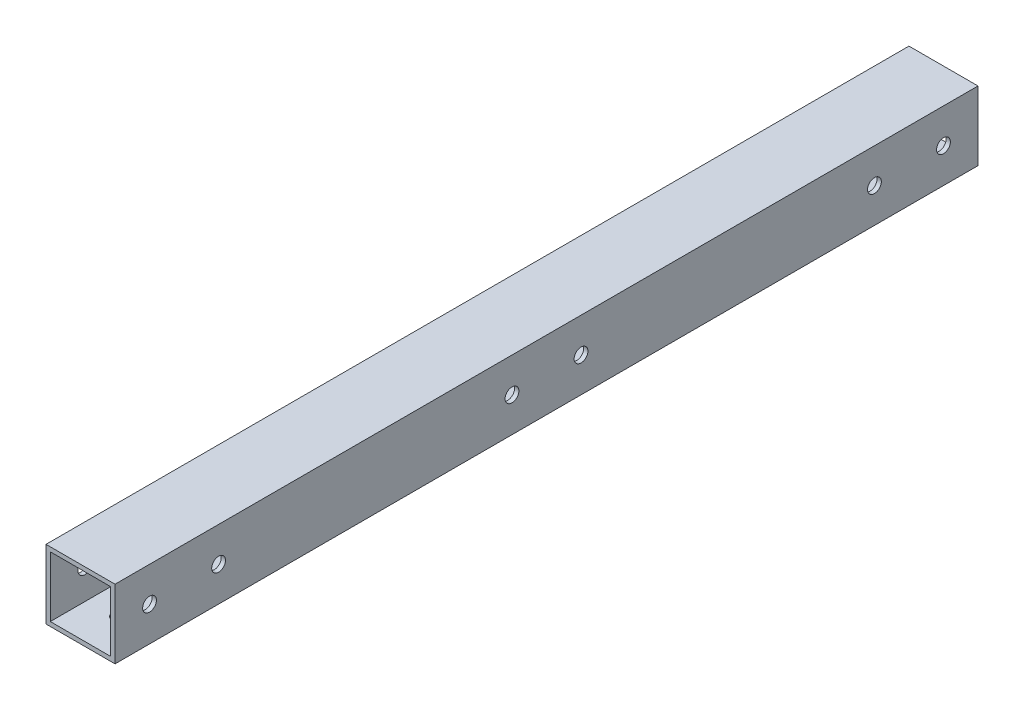
ISO-10303-21;
HEADER;
FILE_DESCRIPTION(('STEP AP214'),'2;1');
FILE_NAME('part.step','',(''),(''),'','','');
FILE_SCHEMA(('AUTOMOTIVE_DESIGN { 1 0 10303 214 1 1 1 1 }'));
ENDSEC;
DATA;
#1=APPLICATION_CONTEXT('core data for automotive mechanical design processes');
#2=APPLICATION_PROTOCOL_DEFINITION('international standard','automotive_design',2000,#1);
#3=PRODUCT_CONTEXT('',#1,'mechanical');
#4=PRODUCT('Part','Part','',(#3));
#5=PRODUCT_RELATED_PRODUCT_CATEGORY('part','',(#4));
#6=PRODUCT_DEFINITION_FORMATION('','',#4);
#7=PRODUCT_DEFINITION_CONTEXT('part definition',#1,'design');
#8=PRODUCT_DEFINITION('design','',#6,#7);
#9=PRODUCT_DEFINITION_SHAPE('','',#8);
#10=(LENGTH_UNIT() NAMED_UNIT(*) SI_UNIT(.MILLI.,.METRE.));
#11=(NAMED_UNIT(*) PLANE_ANGLE_UNIT() SI_UNIT($,.RADIAN.));
#12=(NAMED_UNIT(*) SI_UNIT($,.STERADIAN.) SOLID_ANGLE_UNIT());
#13=UNCERTAINTY_MEASURE_WITH_UNIT(LENGTH_MEASURE(1.E-05),#10,'distance_accuracy_value','');
#14=(GEOMETRIC_REPRESENTATION_CONTEXT(3) GLOBAL_UNCERTAINTY_ASSIGNED_CONTEXT((#13)) GLOBAL_UNIT_ASSIGNED_CONTEXT((#10,
#11,#12)) REPRESENTATION_CONTEXT('',''));
#15=CARTESIAN_POINT('',(0.,0.,0.));
#16=DIRECTION('',(0.,0.,1.));
#17=DIRECTION('',(1.,0.,0.));
#18=AXIS2_PLACEMENT_3D('',#15,#16,#17);
#19=CARTESIAN_POINT('',(0.,0.,317.5));
#20=DIRECTION('',(0.,0.,-1.));
#21=DIRECTION('',(-1.,0.,0.));
#22=AXIS2_PLACEMENT_3D('',#19,#20,#21);
#23=PLANE('',#22);
#24=DIRECTION('',(0.,-1.,0.));
#25=VECTOR('',#24,1.);
#26=CARTESIAN_POINT('',(0.,0.,317.5));
#27=LINE('',#26,#25);
#28=CARTESIAN_POINT('',(0.,25.4,317.5));
#29=VERTEX_POINT('',#28);
#30=CARTESIAN_POINT('',(0.,0.,317.5));
#31=VERTEX_POINT('',#30);
#32=EDGE_CURVE('E157',#29,#31,#27,.T.);
#33=ORIENTED_EDGE('',*,*,#32,.T.);
#34=DIRECTION('',(1.,0.,0.));
#35=VECTOR('',#34,1.);
#36=CARTESIAN_POINT('',(0.,0.,317.5));
#37=LINE('',#36,#35);
#38=CARTESIAN_POINT('',(25.4,0.,317.5));
#39=VERTEX_POINT('',#38);
#40=EDGE_CURVE('E161',#31,#39,#37,.T.);
#41=ORIENTED_EDGE('',*,*,#40,.T.);
#42=DIRECTION('',(0.,1.,0.));
#43=VECTOR('',#42,1.);
#44=CARTESIAN_POINT('',(25.4,0.,317.5));
#45=LINE('',#44,#43);
#46=CARTESIAN_POINT('',(25.4,25.4,317.5));
#47=VERTEX_POINT('',#46);
#48=EDGE_CURVE('E165',#39,#47,#45,.T.);
#49=ORIENTED_EDGE('',*,*,#48,.T.);
#50=DIRECTION('',(-1.,0.,0.));
#51=VECTOR('',#50,1.);
#52=CARTESIAN_POINT('',(0.,25.4,317.5));
#53=LINE('',#52,#51);
#54=EDGE_CURVE('E168',#47,#29,#53,.T.);
#55=ORIENTED_EDGE('',*,*,#54,.T.);
#56=EDGE_LOOP('',(#33,#41,#49,#55));
#57=FACE_BOUND('',#56,.T.);
#58=DIRECTION('',(0.,-1.,0.));
#59=VECTOR('',#58,1.);
#60=CARTESIAN_POINT('',(1.5875,1.5875,317.5));
#61=LINE('',#60,#59);
#62=CARTESIAN_POINT('',(1.5875,23.8125,317.5));
#63=VERTEX_POINT('',#62);
#64=CARTESIAN_POINT('',(1.5875,1.5875,317.5));
#65=VERTEX_POINT('',#64);
#66=EDGE_CURVE('E107',#63,#65,#61,.T.);
#67=ORIENTED_EDGE('',*,*,#66,.F.);
#68=DIRECTION('',(-1.,0.,0.));
#69=VECTOR('',#68,1.);
#70=CARTESIAN_POINT('',(1.5875,23.8125,317.5));
#71=LINE('',#70,#69);
#72=CARTESIAN_POINT('',(23.8125,23.8125,317.5));
#73=VERTEX_POINT('',#72);
#74=EDGE_CURVE('E133',#73,#63,#71,.T.);
#75=ORIENTED_EDGE('',*,*,#74,.F.);
#76=DIRECTION('',(0.,1.,0.));
#77=VECTOR('',#76,1.);
#78=CARTESIAN_POINT('',(23.8125,1.5875,317.5));
#79=LINE('',#78,#77);
#80=CARTESIAN_POINT('',(23.8125,1.5875,317.5));
#81=VERTEX_POINT('',#80);
#82=EDGE_CURVE('E129',#81,#73,#79,.T.);
#83=ORIENTED_EDGE('',*,*,#82,.F.);
#84=DIRECTION('',(1.,0.,0.));
#85=VECTOR('',#84,1.);
#86=CARTESIAN_POINT('',(1.5875,1.5875,317.5));
#87=LINE('',#86,#85);
#88=EDGE_CURVE('E116',#65,#81,#87,.T.);
#89=ORIENTED_EDGE('',*,*,#88,.F.);
#90=EDGE_LOOP('',(#67,#75,#83,#89));
#91=FACE_BOUND('',#90,.T.);
#92=ADVANCED_FACE('F39',(#57,#91),#23,.F.);
#93=CARTESIAN_POINT('',(0.,0.,0.));
#94=DIRECTION('',(0.,0.,-1.));
#95=DIRECTION('',(-1.,0.,0.));
#96=AXIS2_PLACEMENT_3D('',#93,#94,#95);
#97=PLANE('',#96);
#98=DIRECTION('',(0.,-1.,0.));
#99=VECTOR('',#98,1.);
#100=CARTESIAN_POINT('',(0.,0.,0.));
#101=LINE('',#100,#99);
#102=CARTESIAN_POINT('',(0.,25.4,0.));
#103=VERTEX_POINT('',#102);
#104=CARTESIAN_POINT('',(0.,0.,0.));
#105=VERTEX_POINT('',#104);
#106=EDGE_CURVE('E125',#103,#105,#101,.T.);
#107=ORIENTED_EDGE('',*,*,#106,.F.);
#108=DIRECTION('',(-1.,0.,0.));
#109=VECTOR('',#108,1.);
#110=CARTESIAN_POINT('',(0.,25.4,0.));
#111=LINE('',#110,#109);
#112=CARTESIAN_POINT('',(25.4,25.4,0.));
#113=VERTEX_POINT('',#112);
#114=EDGE_CURVE('E162',#113,#103,#111,.T.);
#115=ORIENTED_EDGE('',*,*,#114,.F.);
#116=DIRECTION('',(0.,1.,0.));
#117=VECTOR('',#116,1.);
#118=CARTESIAN_POINT('',(25.4,0.,0.));
#119=LINE('',#118,#117);
#120=CARTESIAN_POINT('',(25.4,0.,0.));
#121=VERTEX_POINT('',#120);
#122=EDGE_CURVE('E178',#121,#113,#119,.T.);
#123=ORIENTED_EDGE('',*,*,#122,.F.);
#124=DIRECTION('',(1.,0.,0.));
#125=VECTOR('',#124,1.);
#126=CARTESIAN_POINT('',(0.,0.,0.));
#127=LINE('',#126,#125);
#128=EDGE_CURVE('E175',#105,#121,#127,.T.);
#129=ORIENTED_EDGE('',*,*,#128,.F.);
#130=EDGE_LOOP('',(#107,#115,#123,#129));
#131=FACE_BOUND('',#130,.T.);
#132=DIRECTION('',(-1.,0.,0.));
#133=VECTOR('',#132,1.);
#134=CARTESIAN_POINT('',(1.5875,23.8125,0.));
#135=LINE('',#134,#133);
#136=CARTESIAN_POINT('',(23.8125,23.8125,0.));
#137=VERTEX_POINT('',#136);
#138=CARTESIAN_POINT('',(1.5875,23.8125,0.));
#139=VERTEX_POINT('',#138);
#140=EDGE_CURVE('E117',#137,#139,#135,.T.);
#141=ORIENTED_EDGE('',*,*,#140,.T.);
#142=DIRECTION('',(0.,-1.,0.));
#143=VECTOR('',#142,1.);
#144=CARTESIAN_POINT('',(1.5875,1.5875,0.));
#145=LINE('',#144,#143);
#146=CARTESIAN_POINT('',(1.5875,1.5875,0.));
#147=VERTEX_POINT('',#146);
#148=EDGE_CURVE('E65',#139,#147,#145,.T.);
#149=ORIENTED_EDGE('',*,*,#148,.T.);
#150=DIRECTION('',(1.,0.,0.));
#151=VECTOR('',#150,1.);
#152=CARTESIAN_POINT('',(1.5875,1.5875,0.));
#153=LINE('',#152,#151);
#154=CARTESIAN_POINT('',(23.8125,1.5875,0.));
#155=VERTEX_POINT('',#154);
#156=EDGE_CURVE('E123',#147,#155,#153,.T.);
#157=ORIENTED_EDGE('',*,*,#156,.T.);
#158=DIRECTION('',(0.,1.,0.));
#159=VECTOR('',#158,1.);
#160=CARTESIAN_POINT('',(23.8125,1.5875,0.));
#161=LINE('',#160,#159);
#162=EDGE_CURVE('E144',#155,#137,#161,.T.);
#163=ORIENTED_EDGE('',*,*,#162,.T.);
#164=EDGE_LOOP('',(#141,#149,#157,#163));
#165=FACE_BOUND('',#164,.T.);
#166=ADVANCED_FACE('F256',(#131,#165),#97,.T.);
#167=CARTESIAN_POINT('',(0.,0.,317.5));
#168=DIRECTION('',(1.,0.,0.));
#169=DIRECTION('',(0.,0.,-1.));
#170=AXIS2_PLACEMENT_3D('',#167,#168,#169);
#171=PLANE('',#170);
#172=CARTESIAN_POINT('',(0.,12.7,304.8));
#173=DIRECTION('',(1.,0.,0.));
#174=DIRECTION('',(0.,0.,-1.));
#175=AXIS2_PLACEMENT_3D('',#172,#173,#174);
#176=CIRCLE('',#175,2.54000000000001);
#177=CARTESIAN_POINT('',(0.,12.7,302.26));
#178=VERTEX_POINT('',#177);
#179=EDGE_CURVE('E198',#178,#178,#176,.T.);
#180=ORIENTED_EDGE('',*,*,#179,.T.);
#181=EDGE_LOOP('',(#180));
#182=FACE_BOUND('',#181,.T.);
#183=CARTESIAN_POINT('',(0.,12.7,279.4));
#184=DIRECTION('',(1.,0.,0.));
#185=DIRECTION('',(0.,0.,-1.));
#186=AXIS2_PLACEMENT_3D('',#183,#184,#185);
#187=CIRCLE('',#186,2.54000000000001);
#188=CARTESIAN_POINT('',(0.,12.7,276.86));
#189=VERTEX_POINT('',#188);
#190=EDGE_CURVE('E332',#189,#189,#187,.T.);
#191=ORIENTED_EDGE('',*,*,#190,.T.);
#192=EDGE_LOOP('',(#191));
#193=FACE_BOUND('',#192,.T.);
#194=CARTESIAN_POINT('',(0.,12.7,171.45));
#195=DIRECTION('',(1.,0.,0.));
#196=DIRECTION('',(0.,0.,-1.));
#197=AXIS2_PLACEMENT_3D('',#194,#195,#196);
#198=CIRCLE('',#197,2.53999999999998);
#199=CARTESIAN_POINT('',(0.,12.7,168.91));
#200=VERTEX_POINT('',#199);
#201=EDGE_CURVE('E340',#200,#200,#198,.T.);
#202=ORIENTED_EDGE('',*,*,#201,.T.);
#203=EDGE_LOOP('',(#202));
#204=FACE_BOUND('',#203,.T.);
#205=CARTESIAN_POINT('',(0.,12.7,146.05));
#206=DIRECTION('',(1.,0.,0.));
#207=DIRECTION('',(0.,0.,1.));
#208=AXIS2_PLACEMENT_3D('',#205,#206,#207);
#209=CIRCLE('',#208,2.53999999999998);
#210=CARTESIAN_POINT('',(0.,12.7,148.59));
#211=VERTEX_POINT('',#210);
#212=EDGE_CURVE('E348',#211,#211,#209,.T.);
#213=ORIENTED_EDGE('',*,*,#212,.T.);
#214=EDGE_LOOP('',(#213));
#215=FACE_BOUND('',#214,.T.);
#216=CARTESIAN_POINT('',(0.,12.7,38.1));
#217=DIRECTION('',(1.,0.,0.));
#218=DIRECTION('',(0.,0.,1.));
#219=AXIS2_PLACEMENT_3D('',#216,#217,#218);
#220=CIRCLE('',#219,2.53999999999998);
#221=CARTESIAN_POINT('',(0.,12.7,40.6399999999999));
#222=VERTEX_POINT('',#221);
#223=EDGE_CURVE('E356',#222,#222,#220,.T.);
#224=ORIENTED_EDGE('',*,*,#223,.T.);
#225=EDGE_LOOP('',(#224));
#226=FACE_BOUND('',#225,.T.);
#227=CARTESIAN_POINT('',(0.,12.7,12.7));
#228=DIRECTION('',(1.,0.,0.));
#229=DIRECTION('',(0.,0.,1.));
#230=AXIS2_PLACEMENT_3D('',#227,#228,#229);
#231=CIRCLE('',#230,2.53999999999998);
#232=CARTESIAN_POINT('',(0.,12.7,15.24));
#233=VERTEX_POINT('',#232);
#234=EDGE_CURVE('E364',#233,#233,#231,.T.);
#235=ORIENTED_EDGE('',*,*,#234,.T.);
#236=EDGE_LOOP('',(#235));
#237=FACE_BOUND('',#236,.T.);
#238=ORIENTED_EDGE('',*,*,#106,.T.);
#239=DIRECTION('',(0.,0.,-1.));
#240=VECTOR('',#239,1.);
#241=CARTESIAN_POINT('',(0.,0.,317.5));
#242=LINE('',#241,#240);
#243=EDGE_CURVE('E11',#31,#105,#242,.T.);
#244=ORIENTED_EDGE('',*,*,#243,.F.);
#245=ORIENTED_EDGE('',*,*,#32,.F.);
#246=DIRECTION('',(0.,0.,-1.));
#247=VECTOR('',#246,1.);
#248=CARTESIAN_POINT('',(0.,25.4,317.5));
#249=LINE('',#248,#247);
#250=EDGE_CURVE('E171',#29,#103,#249,.T.);
#251=ORIENTED_EDGE('',*,*,#250,.T.);
#252=EDGE_LOOP('',(#238,#244,#245,#251));
#253=FACE_BOUND('',#252,.T.);
#254=ADVANCED_FACE('F41',(#182,#193,#204,#215,#226,#237,#253),#171,.F.);
#255=CARTESIAN_POINT('',(0.,0.,317.5));
#256=DIRECTION('',(0.,1.,0.));
#257=DIRECTION('',(0.,0.,1.));
#258=AXIS2_PLACEMENT_3D('',#255,#256,#257);
#259=PLANE('',#258);
#260=CARTESIAN_POINT('',(12.7,0.,303.2125));
#261=DIRECTION('',(0.,-1.,0.));
#262=DIRECTION('',(0.,0.,-1.));
#263=AXIS2_PLACEMENT_3D('',#260,#261,#262);
#264=CIRCLE('',#263,2.54);
#265=CARTESIAN_POINT('',(12.7,0.,300.6725));
#266=VERTEX_POINT('',#265);
#267=EDGE_CURVE('E295',#266,#266,#264,.T.);
#268=ORIENTED_EDGE('',*,*,#267,.F.);
#269=EDGE_LOOP('',(#268));
#270=FACE_BOUND('',#269,.T.);
#271=CARTESIAN_POINT('',(12.7,0.,14.2875000000001));
#272=DIRECTION('',(0.,-1.,0.));
#273=DIRECTION('',(0.,0.,1.));
#274=AXIS2_PLACEMENT_3D('',#271,#272,#273);
#275=CIRCLE('',#274,2.54);
#276=CARTESIAN_POINT('',(12.7,0.,11.7475000000001));
#277=VERTEX_POINT('',#276);
#278=EDGE_CURVE('E299',#277,#277,#275,.T.);
#279=ORIENTED_EDGE('',*,*,#278,.F.);
#280=EDGE_LOOP('',(#279));
#281=FACE_BOUND('',#280,.T.);
#282=ORIENTED_EDGE('',*,*,#128,.T.);
#283=DIRECTION('',(0.,0.,-1.));
#284=VECTOR('',#283,1.);
#285=CARTESIAN_POINT('',(25.4,0.,317.5));
#286=LINE('',#285,#284);
#287=EDGE_CURVE('E49',#39,#121,#286,.T.);
#288=ORIENTED_EDGE('',*,*,#287,.F.);
#289=ORIENTED_EDGE('',*,*,#40,.F.);
#290=ORIENTED_EDGE('',*,*,#243,.T.);
#291=EDGE_LOOP('',(#282,#288,#289,#290));
#292=FACE_BOUND('',#291,.T.);
#293=ADVANCED_FACE('F284',(#270,#281,#292),#259,.F.);
#294=CARTESIAN_POINT('',(25.4,0.,317.5));
#295=DIRECTION('',(-1.,0.,0.));
#296=DIRECTION('',(0.,0.,1.));
#297=AXIS2_PLACEMENT_3D('',#294,#295,#296);
#298=PLANE('',#297);
#299=CARTESIAN_POINT('',(25.4,12.7,304.8));
#300=DIRECTION('',(1.,0.,0.));
#301=DIRECTION('',(0.,0.,-1.));
#302=AXIS2_PLACEMENT_3D('',#299,#300,#301);
#303=CIRCLE('',#302,2.54000000000001);
#304=CARTESIAN_POINT('',(25.4,12.7,302.26));
#305=VERTEX_POINT('',#304);
#306=EDGE_CURVE('E328',#305,#305,#303,.T.);
#307=ORIENTED_EDGE('',*,*,#306,.F.);
#308=EDGE_LOOP('',(#307));
#309=FACE_BOUND('',#308,.T.);
#310=CARTESIAN_POINT('',(25.4,12.7,279.4));
#311=DIRECTION('',(1.,0.,0.));
#312=DIRECTION('',(0.,0.,-1.));
#313=AXIS2_PLACEMENT_3D('',#310,#311,#312);
#314=CIRCLE('',#313,2.54000000000001);
#315=CARTESIAN_POINT('',(25.4,12.7,276.86));
#316=VERTEX_POINT('',#315);
#317=EDGE_CURVE('E336',#316,#316,#314,.T.);
#318=ORIENTED_EDGE('',*,*,#317,.F.);
#319=EDGE_LOOP('',(#318));
#320=FACE_BOUND('',#319,.T.);
#321=CARTESIAN_POINT('',(25.4,12.7,171.45));
#322=DIRECTION('',(1.,0.,0.));
#323=DIRECTION('',(0.,0.,-1.));
#324=AXIS2_PLACEMENT_3D('',#321,#322,#323);
#325=CIRCLE('',#324,2.53999999999998);
#326=CARTESIAN_POINT('',(25.4,12.7,168.91));
#327=VERTEX_POINT('',#326);
#328=EDGE_CURVE('E344',#327,#327,#325,.T.);
#329=ORIENTED_EDGE('',*,*,#328,.F.);
#330=EDGE_LOOP('',(#329));
#331=FACE_BOUND('',#330,.T.);
#332=CARTESIAN_POINT('',(25.4,12.7,146.05));
#333=DIRECTION('',(1.,0.,0.));
#334=DIRECTION('',(0.,0.,1.));
#335=AXIS2_PLACEMENT_3D('',#332,#333,#334);
#336=CIRCLE('',#335,2.53999999999998);
#337=CARTESIAN_POINT('',(25.4,12.7,148.59));
#338=VERTEX_POINT('',#337);
#339=EDGE_CURVE('E352',#338,#338,#336,.T.);
#340=ORIENTED_EDGE('',*,*,#339,.F.);
#341=EDGE_LOOP('',(#340));
#342=FACE_BOUND('',#341,.T.);
#343=CARTESIAN_POINT('',(25.4,12.7,38.1));
#344=DIRECTION('',(1.,0.,0.));
#345=DIRECTION('',(0.,0.,1.));
#346=AXIS2_PLACEMENT_3D('',#343,#344,#345);
#347=CIRCLE('',#346,2.53999999999998);
#348=CARTESIAN_POINT('',(25.4,12.7,40.6399999999999));
#349=VERTEX_POINT('',#348);
#350=EDGE_CURVE('E360',#349,#349,#347,.T.);
#351=ORIENTED_EDGE('',*,*,#350,.F.);
#352=EDGE_LOOP('',(#351));
#353=FACE_BOUND('',#352,.T.);
#354=CARTESIAN_POINT('',(25.4,12.7,12.7));
#355=DIRECTION('',(1.,0.,0.));
#356=DIRECTION('',(0.,0.,1.));
#357=AXIS2_PLACEMENT_3D('',#354,#355,#356);
#358=CIRCLE('',#357,2.53999999999998);
#359=CARTESIAN_POINT('',(25.4,12.7,15.24));
#360=VERTEX_POINT('',#359);
#361=EDGE_CURVE('E368',#360,#360,#358,.T.);
#362=ORIENTED_EDGE('',*,*,#361,.F.);
#363=EDGE_LOOP('',(#362));
#364=FACE_BOUND('',#363,.T.);
#365=ORIENTED_EDGE('',*,*,#122,.T.);
#366=DIRECTION('',(0.,0.,-1.));
#367=VECTOR('',#366,1.);
#368=CARTESIAN_POINT('',(25.4,25.4,317.5));
#369=LINE('',#368,#367);
#370=EDGE_CURVE('E186',#47,#113,#369,.T.);
#371=ORIENTED_EDGE('',*,*,#370,.F.);
#372=ORIENTED_EDGE('',*,*,#48,.F.);
#373=ORIENTED_EDGE('',*,*,#287,.T.);
#374=EDGE_LOOP('',(#365,#371,#372,#373));
#375=FACE_BOUND('',#374,.T.);
#376=ADVANCED_FACE('F281',(#309,#320,#331,#342,#353,#364,#375),#298,.F.);
#377=CARTESIAN_POINT('',(0.,25.4,317.5));
#378=DIRECTION('',(0.,-1.,0.));
#379=DIRECTION('',(0.,0.,-1.));
#380=AXIS2_PLACEMENT_3D('',#377,#378,#379);
#381=PLANE('',#380);
#382=ORIENTED_EDGE('',*,*,#114,.T.);
#383=ORIENTED_EDGE('',*,*,#250,.F.);
#384=ORIENTED_EDGE('',*,*,#54,.F.);
#385=ORIENTED_EDGE('',*,*,#370,.T.);
#386=EDGE_LOOP('',(#382,#383,#384,#385));
#387=FACE_BOUND('',#386,.T.);
#388=ADVANCED_FACE('F278',(#387),#381,.F.);
#389=CARTESIAN_POINT('',(1.5875,1.5875,317.5));
#390=DIRECTION('',(1.,0.,0.));
#391=DIRECTION('',(0.,0.,-1.));
#392=AXIS2_PLACEMENT_3D('',#389,#390,#391);
#393=PLANE('',#392);
#394=CARTESIAN_POINT('',(1.5875,12.7,304.8));
#395=DIRECTION('',(1.,0.,0.));
#396=DIRECTION('',(0.,0.,-1.));
#397=AXIS2_PLACEMENT_3D('',#394,#395,#396);
#398=CIRCLE('',#397,2.54000000000001);
#399=CARTESIAN_POINT('',(1.5875,12.7,302.26));
#400=VERTEX_POINT('',#399);
#401=EDGE_CURVE('E141',#400,#400,#398,.T.);
#402=ORIENTED_EDGE('',*,*,#401,.F.);
#403=EDGE_LOOP('',(#402));
#404=FACE_BOUND('',#403,.T.);
#405=CARTESIAN_POINT('',(1.5875,12.7,279.4));
#406=DIRECTION('',(1.,0.,0.));
#407=DIRECTION('',(0.,0.,-1.));
#408=AXIS2_PLACEMENT_3D('',#405,#406,#407);
#409=CIRCLE('',#408,2.54000000000001);
#410=CARTESIAN_POINT('',(1.5875,12.7,276.86));
#411=VERTEX_POINT('',#410);
#412=EDGE_CURVE('E216',#411,#411,#409,.T.);
#413=ORIENTED_EDGE('',*,*,#412,.F.);
#414=EDGE_LOOP('',(#413));
#415=FACE_BOUND('',#414,.T.);
#416=CARTESIAN_POINT('',(1.5875,12.7,171.45));
#417=DIRECTION('',(1.,0.,0.));
#418=DIRECTION('',(0.,0.,-1.));
#419=AXIS2_PLACEMENT_3D('',#416,#417,#418);
#420=CIRCLE('',#419,2.53999999999998);
#421=CARTESIAN_POINT('',(1.5875,12.7,168.91));
#422=VERTEX_POINT('',#421);
#423=EDGE_CURVE('E212',#422,#422,#420,.T.);
#424=ORIENTED_EDGE('',*,*,#423,.F.);
#425=EDGE_LOOP('',(#424));
#426=FACE_BOUND('',#425,.T.);
#427=CARTESIAN_POINT('',(1.5875,12.7,146.05));
#428=DIRECTION('',(1.,0.,0.));
#429=DIRECTION('',(0.,0.,-1.));
#430=AXIS2_PLACEMENT_3D('',#427,#428,#429);
#431=CIRCLE('',#430,2.53999999999998);
#432=CARTESIAN_POINT('',(1.5875,12.7,143.51));
#433=VERTEX_POINT('',#432);
#434=EDGE_CURVE('E208',#433,#433,#431,.T.);
#435=ORIENTED_EDGE('',*,*,#434,.F.);
#436=EDGE_LOOP('',(#435));
#437=FACE_BOUND('',#436,.T.);
#438=CARTESIAN_POINT('',(1.5875,12.7,38.1));
#439=DIRECTION('',(1.,0.,0.));
#440=DIRECTION('',(0.,0.,-1.));
#441=AXIS2_PLACEMENT_3D('',#438,#439,#440);
#442=CIRCLE('',#441,2.53999999999998);
#443=CARTESIAN_POINT('',(1.5875,12.7,35.56));
#444=VERTEX_POINT('',#443);
#445=EDGE_CURVE('E203',#444,#444,#442,.T.);
#446=ORIENTED_EDGE('',*,*,#445,.F.);
#447=EDGE_LOOP('',(#446));
#448=FACE_BOUND('',#447,.T.);
#449=CARTESIAN_POINT('',(1.5875,12.7,12.7));
#450=DIRECTION('',(1.,0.,0.));
#451=DIRECTION('',(0.,0.,-1.));
#452=AXIS2_PLACEMENT_3D('',#449,#450,#451);
#453=CIRCLE('',#452,2.53999999999998);
#454=CARTESIAN_POINT('',(1.5875,12.7,10.16));
#455=VERTEX_POINT('',#454);
#456=EDGE_CURVE('E197',#455,#455,#453,.T.);
#457=ORIENTED_EDGE('',*,*,#456,.F.);
#458=EDGE_LOOP('',(#457));
#459=FACE_BOUND('',#458,.T.);
#460=ORIENTED_EDGE('',*,*,#148,.F.);
#461=DIRECTION('',(0.,0.,-1.));
#462=VECTOR('',#461,1.);
#463=CARTESIAN_POINT('',(1.5875,23.8125,317.5));
#464=LINE('',#463,#462);
#465=EDGE_CURVE('E111',#63,#139,#464,.T.);
#466=ORIENTED_EDGE('',*,*,#465,.F.);
#467=ORIENTED_EDGE('',*,*,#66,.T.);
#468=DIRECTION('',(0.,0.,-1.));
#469=VECTOR('',#468,1.);
#470=CARTESIAN_POINT('',(1.5875,1.5875,317.5));
#471=LINE('',#470,#469);
#472=EDGE_CURVE('E110',#65,#147,#471,.T.);
#473=ORIENTED_EDGE('',*,*,#472,.T.);
#474=EDGE_LOOP('',(#460,#466,#467,#473));
#475=FACE_BOUND('',#474,.T.);
#476=ADVANCED_FACE('F109',(#404,#415,#426,#437,#448,#459,#475),#393,.T.);
#477=CARTESIAN_POINT('',(1.5875,1.5875,317.5));
#478=DIRECTION('',(0.,1.,0.));
#479=DIRECTION('',(0.,0.,1.));
#480=AXIS2_PLACEMENT_3D('',#477,#478,#479);
#481=PLANE('',#480);
#482=CARTESIAN_POINT('',(12.7,1.5875,303.2125));
#483=DIRECTION('',(0.,1.,0.));
#484=DIRECTION('',(0.,0.,1.));
#485=AXIS2_PLACEMENT_3D('',#482,#483,#484);
#486=CIRCLE('',#485,2.54);
#487=CARTESIAN_POINT('',(12.7,1.5875,300.6725));
#488=VERTEX_POINT('',#487);
#489=EDGE_CURVE('E314',#488,#488,#486,.F.);
#490=ORIENTED_EDGE('',*,*,#489,.T.);
#491=EDGE_LOOP('',(#490));
#492=FACE_BOUND('',#491,.T.);
#493=CARTESIAN_POINT('',(12.7,1.5875,14.2875000000001));
#494=DIRECTION('',(0.,1.,0.));
#495=DIRECTION('',(0.,0.,1.));
#496=AXIS2_PLACEMENT_3D('',#493,#494,#495);
#497=CIRCLE('',#496,2.54);
#498=CARTESIAN_POINT('',(12.7,1.5875,11.7475000000001));
#499=VERTEX_POINT('',#498);
#500=EDGE_CURVE('E315',#499,#499,#497,.F.);
#501=ORIENTED_EDGE('',*,*,#500,.T.);
#502=EDGE_LOOP('',(#501));
#503=FACE_BOUND('',#502,.T.);
#504=ORIENTED_EDGE('',*,*,#156,.F.);
#505=ORIENTED_EDGE('',*,*,#472,.F.);
#506=ORIENTED_EDGE('',*,*,#88,.T.);
#507=DIRECTION('',(0.,0.,-1.));
#508=VECTOR('',#507,1.);
#509=CARTESIAN_POINT('',(23.8125,1.5875,317.5));
#510=LINE('',#509,#508);
#511=EDGE_CURVE('E126',#81,#155,#510,.T.);
#512=ORIENTED_EDGE('',*,*,#511,.T.);
#513=EDGE_LOOP('',(#504,#505,#506,#512));
#514=FACE_BOUND('',#513,.T.);
#515=ADVANCED_FACE('F120',(#492,#503,#514),#481,.T.);
#516=CARTESIAN_POINT('',(23.8125,1.5875,317.5));
#517=DIRECTION('',(-1.,0.,0.));
#518=DIRECTION('',(0.,0.,1.));
#519=AXIS2_PLACEMENT_3D('',#516,#517,#518);
#520=PLANE('',#519);
#521=CARTESIAN_POINT('',(23.8125,12.7,304.8));
#522=DIRECTION('',(-1.,0.,0.));
#523=DIRECTION('',(0.,0.,1.));
#524=AXIS2_PLACEMENT_3D('',#521,#522,#523);
#525=CIRCLE('',#524,2.54000000000001);
#526=CARTESIAN_POINT('',(23.8125,12.7,307.34));
#527=VERTEX_POINT('',#526);
#528=EDGE_CURVE('E43',#527,#527,#525,.T.);
#529=ORIENTED_EDGE('',*,*,#528,.F.);
#530=EDGE_LOOP('',(#529));
#531=FACE_BOUND('',#530,.T.);
#532=CARTESIAN_POINT('',(23.8125,12.7,279.4));
#533=DIRECTION('',(-1.,0.,0.));
#534=DIRECTION('',(0.,0.,1.));
#535=AXIS2_PLACEMENT_3D('',#532,#533,#534);
#536=CIRCLE('',#535,2.54000000000001);
#537=CARTESIAN_POINT('',(23.8125,12.7,281.94));
#538=VERTEX_POINT('',#537);
#539=EDGE_CURVE('E213',#538,#538,#536,.T.);
#540=ORIENTED_EDGE('',*,*,#539,.F.);
#541=EDGE_LOOP('',(#540));
#542=FACE_BOUND('',#541,.T.);
#543=CARTESIAN_POINT('',(23.8125,12.7,171.45));
#544=DIRECTION('',(-1.,0.,0.));
#545=DIRECTION('',(0.,0.,1.));
#546=AXIS2_PLACEMENT_3D('',#543,#544,#545);
#547=CIRCLE('',#546,2.53999999999998);
#548=CARTESIAN_POINT('',(23.8125,12.7,173.99));
#549=VERTEX_POINT('',#548);
#550=EDGE_CURVE('E209',#549,#549,#547,.T.);
#551=ORIENTED_EDGE('',*,*,#550,.F.);
#552=EDGE_LOOP('',(#551));
#553=FACE_BOUND('',#552,.T.);
#554=CARTESIAN_POINT('',(23.8125,12.7,146.05));
#555=DIRECTION('',(-1.,0.,0.));
#556=DIRECTION('',(0.,0.,1.));
#557=AXIS2_PLACEMENT_3D('',#554,#555,#556);
#558=CIRCLE('',#557,2.53999999999998);
#559=CARTESIAN_POINT('',(23.8125,12.7,148.59));
#560=VERTEX_POINT('',#559);
#561=EDGE_CURVE('E204',#560,#560,#558,.T.);
#562=ORIENTED_EDGE('',*,*,#561,.F.);
#563=EDGE_LOOP('',(#562));
#564=FACE_BOUND('',#563,.T.);
#565=CARTESIAN_POINT('',(23.8125,12.7,38.1));
#566=DIRECTION('',(-1.,0.,0.));
#567=DIRECTION('',(0.,0.,1.));
#568=AXIS2_PLACEMENT_3D('',#565,#566,#567);
#569=CIRCLE('',#568,2.53999999999998);
#570=CARTESIAN_POINT('',(23.8125,12.7,40.6399999999999));
#571=VERTEX_POINT('',#570);
#572=EDGE_CURVE('E199',#571,#571,#569,.T.);
#573=ORIENTED_EDGE('',*,*,#572,.F.);
#574=EDGE_LOOP('',(#573));
#575=FACE_BOUND('',#574,.T.);
#576=CARTESIAN_POINT('',(23.8125,12.7,12.7));
#577=DIRECTION('',(-1.,0.,0.));
#578=DIRECTION('',(0.,0.,1.));
#579=AXIS2_PLACEMENT_3D('',#576,#577,#578);
#580=CIRCLE('',#579,2.53999999999998);
#581=CARTESIAN_POINT('',(23.8125,12.7,15.24));
#582=VERTEX_POINT('',#581);
#583=EDGE_CURVE('E193',#582,#582,#580,.T.);
#584=ORIENTED_EDGE('',*,*,#583,.F.);
#585=EDGE_LOOP('',(#584));
#586=FACE_BOUND('',#585,.T.);
#587=ORIENTED_EDGE('',*,*,#162,.F.);
#588=ORIENTED_EDGE('',*,*,#511,.F.);
#589=ORIENTED_EDGE('',*,*,#82,.T.);
#590=DIRECTION('',(0.,0.,-1.));
#591=VECTOR('',#590,1.);
#592=CARTESIAN_POINT('',(23.8125,23.8125,317.5));
#593=LINE('',#592,#591);
#594=EDGE_CURVE('E57',#73,#137,#593,.T.);
#595=ORIENTED_EDGE('',*,*,#594,.T.);
#596=EDGE_LOOP('',(#587,#588,#589,#595));
#597=FACE_BOUND('',#596,.T.);
#598=ADVANCED_FACE('F240',(#531,#542,#553,#564,#575,#586,#597),#520,.T.);
#599=CARTESIAN_POINT('',(1.5875,23.8125,317.5));
#600=DIRECTION('',(0.,-1.,0.));
#601=DIRECTION('',(0.,0.,-1.));
#602=AXIS2_PLACEMENT_3D('',#599,#600,#601);
#603=PLANE('',#602);
#604=ORIENTED_EDGE('',*,*,#140,.F.);
#605=ORIENTED_EDGE('',*,*,#594,.F.);
#606=ORIENTED_EDGE('',*,*,#74,.T.);
#607=ORIENTED_EDGE('',*,*,#465,.T.);
#608=EDGE_LOOP('',(#604,#605,#606,#607));
#609=FACE_BOUND('',#608,.T.);
#610=ADVANCED_FACE('F243',(#609),#603,.T.);
#611=CARTESIAN_POINT('',(0.,12.7,12.7));
#612=DIRECTION('',(1.,0.,0.));
#613=DIRECTION('',(0.,0.,-1.));
#614=AXIS2_PLACEMENT_3D('',#611,#612,#613);
#615=CYLINDRICAL_SURFACE('',#614,2.53999999999998);
#616=ORIENTED_EDGE('',*,*,#583,.T.);
#617=EDGE_LOOP('',(#616));
#618=FACE_BOUND('',#617,.T.);
#619=ORIENTED_EDGE('',*,*,#361,.T.);
#620=EDGE_LOOP('',(#619));
#621=FACE_BOUND('',#620,.T.);
#622=ADVANCED_FACE('F258',(#618,#621),#615,.F.);
#623=CARTESIAN_POINT('',(0.,12.7,38.1));
#624=DIRECTION('',(1.,0.,0.));
#625=DIRECTION('',(0.,0.,-1.));
#626=AXIS2_PLACEMENT_3D('',#623,#624,#625);
#627=CYLINDRICAL_SURFACE('',#626,2.53999999999998);
#628=ORIENTED_EDGE('',*,*,#572,.T.);
#629=EDGE_LOOP('',(#628));
#630=FACE_BOUND('',#629,.T.);
#631=ORIENTED_EDGE('',*,*,#350,.T.);
#632=EDGE_LOOP('',(#631));
#633=FACE_BOUND('',#632,.T.);
#634=ADVANCED_FACE('F263',(#630,#633),#627,.F.);
#635=CARTESIAN_POINT('',(0.,12.7,146.05));
#636=DIRECTION('',(1.,0.,0.));
#637=DIRECTION('',(0.,0.,-1.));
#638=AXIS2_PLACEMENT_3D('',#635,#636,#637);
#639=CYLINDRICAL_SURFACE('',#638,2.53999999999998);
#640=ORIENTED_EDGE('',*,*,#561,.T.);
#641=EDGE_LOOP('',(#640));
#642=FACE_BOUND('',#641,.T.);
#643=ORIENTED_EDGE('',*,*,#339,.T.);
#644=EDGE_LOOP('',(#643));
#645=FACE_BOUND('',#644,.T.);
#646=ADVANCED_FACE('F401',(#642,#645),#639,.F.);
#647=CARTESIAN_POINT('',(0.,12.7,171.45));
#648=DIRECTION('',(1.,0.,0.));
#649=DIRECTION('',(0.,0.,-1.));
#650=AXIS2_PLACEMENT_3D('',#647,#648,#649);
#651=CYLINDRICAL_SURFACE('',#650,2.53999999999998);
#652=ORIENTED_EDGE('',*,*,#550,.T.);
#653=EDGE_LOOP('',(#652));
#654=FACE_BOUND('',#653,.T.);
#655=ORIENTED_EDGE('',*,*,#328,.T.);
#656=EDGE_LOOP('',(#655));
#657=FACE_BOUND('',#656,.T.);
#658=ADVANCED_FACE('F405',(#654,#657),#651,.F.);
#659=CARTESIAN_POINT('',(0.,12.7,279.4));
#660=DIRECTION('',(1.,0.,0.));
#661=DIRECTION('',(0.,0.,-1.));
#662=AXIS2_PLACEMENT_3D('',#659,#660,#661);
#663=CYLINDRICAL_SURFACE('',#662,2.54000000000001);
#664=ORIENTED_EDGE('',*,*,#539,.T.);
#665=EDGE_LOOP('',(#664));
#666=FACE_BOUND('',#665,.T.);
#667=ORIENTED_EDGE('',*,*,#317,.T.);
#668=EDGE_LOOP('',(#667));
#669=FACE_BOUND('',#668,.T.);
#670=ADVANCED_FACE('F396',(#666,#669),#663,.F.);
#671=CARTESIAN_POINT('',(0.,12.7,304.8));
#672=DIRECTION('',(1.,0.,0.));
#673=DIRECTION('',(0.,0.,-1.));
#674=AXIS2_PLACEMENT_3D('',#671,#672,#673);
#675=CYLINDRICAL_SURFACE('',#674,2.54000000000001);
#676=ORIENTED_EDGE('',*,*,#528,.T.);
#677=EDGE_LOOP('',(#676));
#678=FACE_BOUND('',#677,.T.);
#679=ORIENTED_EDGE('',*,*,#306,.T.);
#680=EDGE_LOOP('',(#679));
#681=FACE_BOUND('',#680,.T.);
#682=ADVANCED_FACE('F237',(#678,#681),#675,.F.);
#683=ORIENTED_EDGE('',*,*,#456,.T.);
#684=EDGE_LOOP('',(#683));
#685=FACE_BOUND('',#684,.T.);
#686=ORIENTED_EDGE('',*,*,#234,.F.);
#687=EDGE_LOOP('',(#686));
#688=FACE_BOUND('',#687,.T.);
#689=ADVANCED_FACE('F266',(#685,#688),#615,.F.);
#690=ORIENTED_EDGE('',*,*,#445,.T.);
#691=EDGE_LOOP('',(#690));
#692=FACE_BOUND('',#691,.T.);
#693=ORIENTED_EDGE('',*,*,#223,.F.);
#694=EDGE_LOOP('',(#693));
#695=FACE_BOUND('',#694,.T.);
#696=ADVANCED_FACE('F378',(#692,#695),#627,.F.);
#697=ORIENTED_EDGE('',*,*,#434,.T.);
#698=EDGE_LOOP('',(#697));
#699=FACE_BOUND('',#698,.T.);
#700=ORIENTED_EDGE('',*,*,#212,.F.);
#701=EDGE_LOOP('',(#700));
#702=FACE_BOUND('',#701,.T.);
#703=ADVANCED_FACE('F394',(#699,#702),#639,.F.);
#704=ORIENTED_EDGE('',*,*,#423,.T.);
#705=EDGE_LOOP('',(#704));
#706=FACE_BOUND('',#705,.T.);
#707=ORIENTED_EDGE('',*,*,#201,.F.);
#708=EDGE_LOOP('',(#707));
#709=FACE_BOUND('',#708,.T.);
#710=ADVANCED_FACE('F410',(#706,#709),#651,.F.);
#711=ORIENTED_EDGE('',*,*,#412,.T.);
#712=EDGE_LOOP('',(#711));
#713=FACE_BOUND('',#712,.T.);
#714=ORIENTED_EDGE('',*,*,#190,.F.);
#715=EDGE_LOOP('',(#714));
#716=FACE_BOUND('',#715,.T.);
#717=ADVANCED_FACE('F412',(#713,#716),#663,.F.);
#718=ORIENTED_EDGE('',*,*,#401,.T.);
#719=EDGE_LOOP('',(#718));
#720=FACE_BOUND('',#719,.T.);
#721=ORIENTED_EDGE('',*,*,#179,.F.);
#722=EDGE_LOOP('',(#721));
#723=FACE_BOUND('',#722,.T.);
#724=ADVANCED_FACE('F398',(#720,#723),#675,.F.);
#725=CARTESIAN_POINT('',(12.7,25.401,14.2875000000001));
#726=DIRECTION('',(0.,-1.,0.));
#727=DIRECTION('',(0.,0.,-1.));
#728=AXIS2_PLACEMENT_3D('',#725,#726,#727);
#729=CYLINDRICAL_SURFACE('',#728,2.54);
#730=CARTESIAN_POINT('',(12.7,1.5875,11.7475000000001));
#731=CARTESIAN_POINT('',(12.7,1.57096354166666,11.7475000000001));
#732=CARTESIAN_POINT('',(12.7,1.55442708333333,11.7475000000001));
#733=CARTESIAN_POINT('',(12.7,1.52135416666666,11.7475000000001));
#734=CARTESIAN_POINT('',(12.7,1.50481770833333,11.7475000000001));
#735=CARTESIAN_POINT('',(12.7,1.47174479166666,11.7475000000001));
#736=CARTESIAN_POINT('',(12.7,1.45520833333333,11.7475000000001));
#737=CARTESIAN_POINT('',(12.7,1.42213541666666,11.7475000000001));
#738=CARTESIAN_POINT('',(12.7,1.40559895833333,11.7475000000001));
#739=CARTESIAN_POINT('',(12.7,1.37252604166666,11.7475000000001));
#740=CARTESIAN_POINT('',(12.7,1.35598958333333,11.7475000000001));
#741=CARTESIAN_POINT('',(12.7,1.32291666666666,11.7475000000001));
#742=CARTESIAN_POINT('',(12.7,1.30638020833333,11.7475000000001));
#743=CARTESIAN_POINT('',(12.7,1.27330729166666,11.7475000000001));
#744=CARTESIAN_POINT('',(12.7,1.25677083333333,11.7475000000001));
#745=CARTESIAN_POINT('',(12.7,1.22369791666666,11.7475000000001));
#746=CARTESIAN_POINT('',(12.7,1.20716145833333,11.7475000000001));
#747=CARTESIAN_POINT('',(12.7,1.17408854166666,11.7475000000001));
#748=CARTESIAN_POINT('',(12.7,1.15755208333333,11.7475000000001));
#749=CARTESIAN_POINT('',(12.7,1.12447916666667,11.7475000000001));
#750=CARTESIAN_POINT('',(12.7,1.10794270833333,11.7475000000001));
#751=CARTESIAN_POINT('',(12.7,1.07486979166667,11.7475000000001));
#752=CARTESIAN_POINT('',(12.7,1.05833333333333,11.7475000000001));
#753=CARTESIAN_POINT('',(12.7,1.02526041666666,11.7475000000001));
#754=CARTESIAN_POINT('',(12.7,1.00872395833333,11.7475000000001));
#755=CARTESIAN_POINT('',(12.7,0.975651041666665,11.7475000000001));
#756=CARTESIAN_POINT('',(12.7,0.959114583333332,11.7475000000001));
#757=CARTESIAN_POINT('',(12.7,0.926041666666665,11.7475000000001));
#758=CARTESIAN_POINT('',(12.7,0.909505208333331,11.7475000000001));
#759=CARTESIAN_POINT('',(12.7,0.876432291666664,11.7475000000001));
#760=CARTESIAN_POINT('',(12.7,0.859895833333331,11.7475000000001));
#761=CARTESIAN_POINT('',(12.7,0.826822916666665,11.7475000000001));
#762=CARTESIAN_POINT('',(12.7,0.810286458333332,11.7475000000001));
#763=CARTESIAN_POINT('',(12.7,0.777213541666666,11.7475000000001));
#764=CARTESIAN_POINT('',(12.7,0.760677083333333,11.7475000000001));
#765=CARTESIAN_POINT('',(12.7,0.727604166666667,11.7475000000001));
#766=CARTESIAN_POINT('',(12.7,0.711067708333335,11.7475000000001));
#767=CARTESIAN_POINT('',(12.7,0.677994791666667,11.7475000000001));
#768=CARTESIAN_POINT('',(12.7,0.661458333333333,11.7475000000001));
#769=CARTESIAN_POINT('',(12.7,0.628385416666666,11.7475000000001));
#770=CARTESIAN_POINT('',(12.7,0.611848958333333,11.7475000000001));
#771=CARTESIAN_POINT('',(12.7,0.578776041666667,11.7475000000001));
#772=CARTESIAN_POINT('',(12.7,0.562239583333334,11.7475000000001));
#773=CARTESIAN_POINT('',(12.7,0.529166666666667,11.7475000000001));
#774=CARTESIAN_POINT('',(12.7,0.512630208333333,11.7475000000001));
#775=CARTESIAN_POINT('',(12.7,0.479557291666666,11.7475000000001));
#776=CARTESIAN_POINT('',(12.7,0.463020833333333,11.7475000000001));
#777=CARTESIAN_POINT('',(12.7,0.429947916666667,11.7475000000001));
#778=CARTESIAN_POINT('',(12.7,0.413411458333334,11.7475000000001));
#779=CARTESIAN_POINT('',(12.7,0.380338541666668,11.7475000000001));
#780=CARTESIAN_POINT('',(12.7,0.363802083333335,11.7475000000001));
#781=CARTESIAN_POINT('',(12.7,0.33072916666667,11.7475000000001));
#782=CARTESIAN_POINT('',(12.7,0.314192708333337,11.7475000000001));
#783=CARTESIAN_POINT('',(12.7,0.28111979166667,11.7475000000001));
#784=CARTESIAN_POINT('',(12.7,0.264583333333335,11.7475000000001));
#785=CARTESIAN_POINT('',(12.7,0.231510416666668,11.7475000000001));
#786=CARTESIAN_POINT('',(12.7,0.214973958333335,11.7475000000001));
#787=CARTESIAN_POINT('',(12.7,0.181901041666669,11.7475000000001));
#788=CARTESIAN_POINT('',(12.7,0.165364583333337,11.7475000000001));
#789=CARTESIAN_POINT('',(12.7,0.132291666666669,11.7475000000001));
#790=CARTESIAN_POINT('',(12.7,0.115755208333335,11.7475000000001));
#791=CARTESIAN_POINT('',(12.7,0.0826822916666683,11.7475000000001));
#792=CARTESIAN_POINT('',(12.7,0.0661458333333353,11.7475000000001));
#793=CARTESIAN_POINT('',(12.7,0.0330729166666694,11.7475000000001));
#794=CARTESIAN_POINT('',(12.7,0.0165364583333364,11.7475000000001));
#795=CARTESIAN_POINT('',(12.7,0.,11.7475000000001));
#796=B_SPLINE_CURVE_WITH_KNOTS('',3,(#730,#731,#732,#733,#734,#735,#736,#737,#738,#739,#740,
#741,#742,#743,#744,#745,#746,#747,#748,#749,#750,#751,#752,#753,#754,#755,#756,#757,#758,#759,
#760,#761,#762,#763,#764,#765,#766,#767,#768,#769,#770,#771,#772,#773,#774,#775,#776,#777,#778,
#779,#780,#781,#782,#783,#784,#785,#786,#787,#788,#789,#790,#791,#792,#793,#794,#795),
.UNSPECIFIED.,.F.,.F.,(4,2,2,2,2,2,2,2,2,2,2,2,2,2,2,2,2,2,2,2,2,2,2,2,2,2,2,2,2,2,2,2,4),(0.,
0.0496093749999989,0.0992187499999977,0.148828125,0.198437499999999,0.248046874999998,
0.29765625,0.347265624999999,0.396874999999998,0.446484374999997,0.496093749999996,
0.545703124999998,0.595312499999997,0.644921874999996,0.694531249999998,0.744140624999997,
0.793749999999996,0.843359374999995,0.892968749999994,0.942578124999996,0.992187499999995,
1.04179687499999,1.09140625,1.14101562499999,1.19062499999999,1.24023437499999,1.28984374999999,
1.33945312499999,1.38906249999999,1.43867187499999,1.48828124999999,1.53789062499999,
1.58749999999999),.UNSPECIFIED.);
#797=EDGE_CURVE('BSEAM414',#499,#277,#796,.T.);
#798=ORIENTED_EDGE('',*,*,#500,.F.);
#799=ORIENTED_EDGE('',*,*,#278,.T.);
#800=ORIENTED_EDGE('',*,*,#797,.T.);
#801=ORIENTED_EDGE('',*,*,#797,.F.);
#802=EDGE_LOOP('',(#798,#800,#799,#801));
#803=FACE_BOUND('',#802,.T.);
#804=ADVANCED_FACE('F414',(#803),#729,.F.);
#805=CARTESIAN_POINT('',(12.7,25.401,303.2125));
#806=DIRECTION('',(0.,-1.,0.));
#807=DIRECTION('',(0.,0.,-1.));
#808=AXIS2_PLACEMENT_3D('',#805,#806,#807);
#809=CYLINDRICAL_SURFACE('',#808,2.54);
#810=CARTESIAN_POINT('',(12.7,1.5875,300.6725));
#811=CARTESIAN_POINT('',(12.7,1.57096354166666,300.6725));
#812=CARTESIAN_POINT('',(12.7,1.55442708333333,300.6725));
#813=CARTESIAN_POINT('',(12.7,1.52135416666666,300.6725));
#814=CARTESIAN_POINT('',(12.7,1.50481770833333,300.6725));
#815=CARTESIAN_POINT('',(12.7,1.47174479166666,300.6725));
#816=CARTESIAN_POINT('',(12.7,1.45520833333333,300.6725));
#817=CARTESIAN_POINT('',(12.7,1.42213541666666,300.6725));
#818=CARTESIAN_POINT('',(12.7,1.40559895833333,300.6725));
#819=CARTESIAN_POINT('',(12.7,1.37252604166666,300.6725));
#820=CARTESIAN_POINT('',(12.7,1.35598958333333,300.6725));
#821=CARTESIAN_POINT('',(12.7,1.32291666666666,300.6725));
#822=CARTESIAN_POINT('',(12.7,1.30638020833333,300.6725));
#823=CARTESIAN_POINT('',(12.7,1.27330729166666,300.6725));
#824=CARTESIAN_POINT('',(12.7,1.25677083333333,300.6725));
#825=CARTESIAN_POINT('',(12.7,1.22369791666666,300.6725));
#826=CARTESIAN_POINT('',(12.7,1.20716145833333,300.6725));
#827=CARTESIAN_POINT('',(12.7,1.17408854166666,300.6725));
#828=CARTESIAN_POINT('',(12.7,1.15755208333333,300.6725));
#829=CARTESIAN_POINT('',(12.7,1.12447916666667,300.6725));
#830=CARTESIAN_POINT('',(12.7,1.10794270833333,300.6725));
#831=CARTESIAN_POINT('',(12.7,1.07486979166667,300.6725));
#832=CARTESIAN_POINT('',(12.7,1.05833333333333,300.6725));
#833=CARTESIAN_POINT('',(12.7,1.02526041666666,300.6725));
#834=CARTESIAN_POINT('',(12.7,1.00872395833333,300.6725));
#835=CARTESIAN_POINT('',(12.7,0.975651041666665,300.6725));
#836=CARTESIAN_POINT('',(12.7,0.959114583333332,300.6725));
#837=CARTESIAN_POINT('',(12.7,0.926041666666665,300.6725));
#838=CARTESIAN_POINT('',(12.7,0.909505208333331,300.6725));
#839=CARTESIAN_POINT('',(12.7,0.876432291666664,300.6725));
#840=CARTESIAN_POINT('',(12.7,0.859895833333331,300.6725));
#841=CARTESIAN_POINT('',(12.7,0.826822916666665,300.6725));
#842=CARTESIAN_POINT('',(12.7,0.810286458333332,300.6725));
#843=CARTESIAN_POINT('',(12.7,0.777213541666666,300.6725));
#844=CARTESIAN_POINT('',(12.7,0.760677083333333,300.6725));
#845=CARTESIAN_POINT('',(12.7,0.727604166666667,300.6725));
#846=CARTESIAN_POINT('',(12.7,0.711067708333335,300.6725));
#847=CARTESIAN_POINT('',(12.7,0.677994791666667,300.6725));
#848=CARTESIAN_POINT('',(12.7,0.661458333333333,300.6725));
#849=CARTESIAN_POINT('',(12.7,0.628385416666666,300.6725));
#850=CARTESIAN_POINT('',(12.7,0.611848958333333,300.6725));
#851=CARTESIAN_POINT('',(12.7,0.578776041666667,300.6725));
#852=CARTESIAN_POINT('',(12.7,0.562239583333334,300.6725));
#853=CARTESIAN_POINT('',(12.7,0.529166666666667,300.6725));
#854=CARTESIAN_POINT('',(12.7,0.512630208333333,300.6725));
#855=CARTESIAN_POINT('',(12.7,0.479557291666666,300.6725));
#856=CARTESIAN_POINT('',(12.7,0.463020833333333,300.6725));
#857=CARTESIAN_POINT('',(12.7,0.429947916666667,300.6725));
#858=CARTESIAN_POINT('',(12.7,0.413411458333334,300.6725));
#859=CARTESIAN_POINT('',(12.7,0.380338541666668,300.6725));
#860=CARTESIAN_POINT('',(12.7,0.363802083333335,300.6725));
#861=CARTESIAN_POINT('',(12.7,0.33072916666667,300.6725));
#862=CARTESIAN_POINT('',(12.7,0.314192708333337,300.6725));
#863=CARTESIAN_POINT('',(12.7,0.28111979166667,300.6725));
#864=CARTESIAN_POINT('',(12.7,0.264583333333335,300.6725));
#865=CARTESIAN_POINT('',(12.7,0.231510416666668,300.6725));
#866=CARTESIAN_POINT('',(12.7,0.214973958333335,300.6725));
#867=CARTESIAN_POINT('',(12.7,0.181901041666669,300.6725));
#868=CARTESIAN_POINT('',(12.7,0.165364583333337,300.6725));
#869=CARTESIAN_POINT('',(12.7,0.132291666666669,300.6725));
#870=CARTESIAN_POINT('',(12.7,0.115755208333335,300.6725));
#871=CARTESIAN_POINT('',(12.7,0.0826822916666683,300.6725));
#872=CARTESIAN_POINT('',(12.7,0.0661458333333353,300.6725));
#873=CARTESIAN_POINT('',(12.7,0.0330729166666694,300.6725));
#874=CARTESIAN_POINT('',(12.7,0.0165364583333364,300.6725));
#875=CARTESIAN_POINT('',(12.7,0.,300.6725));
#876=B_SPLINE_CURVE_WITH_KNOTS('',3,(#810,#811,#812,#813,#814,#815,#816,#817,#818,#819,#820,
#821,#822,#823,#824,#825,#826,#827,#828,#829,#830,#831,#832,#833,#834,#835,#836,#837,#838,#839,
#840,#841,#842,#843,#844,#845,#846,#847,#848,#849,#850,#851,#852,#853,#854,#855,#856,#857,#858,
#859,#860,#861,#862,#863,#864,#865,#866,#867,#868,#869,#870,#871,#872,#873,#874,#875),
.UNSPECIFIED.,.F.,.F.,(4,2,2,2,2,2,2,2,2,2,2,2,2,2,2,2,2,2,2,2,2,2,2,2,2,2,2,2,2,2,2,2,4),(0.,
0.0496093749999989,0.0992187499999977,0.148828125,0.198437499999999,0.248046874999998,
0.29765625,0.347265624999999,0.396874999999998,0.446484374999997,0.496093749999996,
0.545703124999998,0.595312499999997,0.644921874999996,0.694531249999998,0.744140624999997,
0.793749999999996,0.843359374999995,0.892968749999994,0.942578124999996,0.992187499999995,
1.04179687499999,1.09140625,1.14101562499999,1.19062499999999,1.24023437499999,1.28984374999999,
1.33945312499999,1.38906249999999,1.43867187499999,1.48828124999999,1.53789062499999,
1.58749999999999),.UNSPECIFIED.);
#877=EDGE_CURVE('BSEAM417',#488,#266,#876,.T.);
#878=ORIENTED_EDGE('',*,*,#489,.F.);
#879=ORIENTED_EDGE('',*,*,#267,.T.);
#880=ORIENTED_EDGE('',*,*,#877,.T.);
#881=ORIENTED_EDGE('',*,*,#877,.F.);
#882=EDGE_LOOP('',(#878,#880,#879,#881));
#883=FACE_BOUND('',#882,.T.);
#884=ADVANCED_FACE('F417',(#883),#809,.F.);
#885=CLOSED_SHELL('',(#92,#166,#254,#293,#376,#388,#476,#515,#598,#610,#622,#634,#646,#658,#670,
#682,#689,#696,#703,#710,#717,#724,#804,#884));
#886=MANIFOLD_SOLID_BREP('B2',#885);
#887=ADVANCED_BREP_SHAPE_REPRESENTATION('',(#18,#886),#14);
#888=SHAPE_DEFINITION_REPRESENTATION(#9,#887);
ENDSEC;
END-ISO-10303-21;
